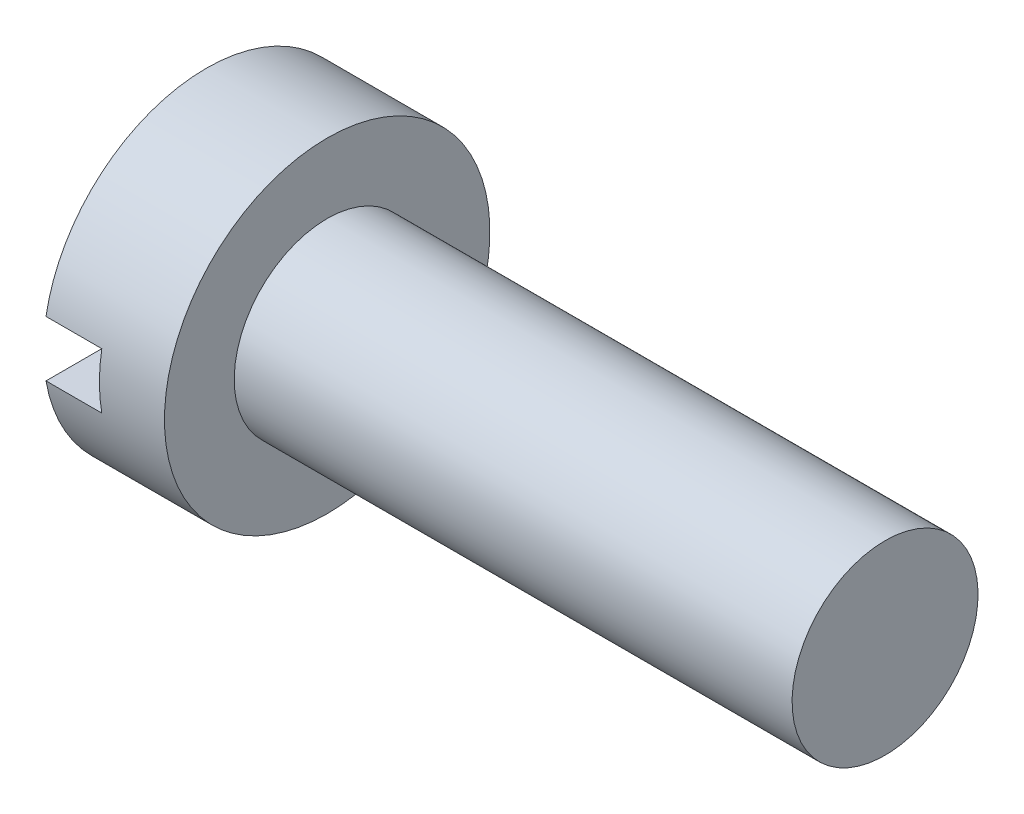
ISO-10303-21;
HEADER;
FILE_DESCRIPTION(('STEP AP214'),'2;1');
FILE_NAME('part.step','',(''),(''),'','','');
FILE_SCHEMA(('AUTOMOTIVE_DESIGN { 1 0 10303 214 1 1 1 1 }'));
ENDSEC;
DATA;
#1=APPLICATION_CONTEXT('core data for automotive mechanical design processes');
#2=APPLICATION_PROTOCOL_DEFINITION('international standard','automotive_design',2000,#1);
#3=PRODUCT_CONTEXT('',#1,'mechanical');
#4=PRODUCT('Part','Part','',(#3));
#5=PRODUCT_RELATED_PRODUCT_CATEGORY('part','',(#4));
#6=PRODUCT_DEFINITION_FORMATION('','',#4);
#7=PRODUCT_DEFINITION_CONTEXT('part definition',#1,'design');
#8=PRODUCT_DEFINITION('design','',#6,#7);
#9=PRODUCT_DEFINITION_SHAPE('','',#8);
#10=(LENGTH_UNIT() NAMED_UNIT(*) SI_UNIT(.MILLI.,.METRE.));
#11=(NAMED_UNIT(*) PLANE_ANGLE_UNIT() SI_UNIT($,.RADIAN.));
#12=(NAMED_UNIT(*) SI_UNIT($,.STERADIAN.) SOLID_ANGLE_UNIT());
#13=UNCERTAINTY_MEASURE_WITH_UNIT(LENGTH_MEASURE(1.E-05),#10,'distance_accuracy_value','');
#14=(GEOMETRIC_REPRESENTATION_CONTEXT(3) GLOBAL_UNCERTAINTY_ASSIGNED_CONTEXT((#13)) GLOBAL_UNIT_ASSIGNED_CONTEXT((#10,
#11,#12)) REPRESENTATION_CONTEXT('',''));
#15=CARTESIAN_POINT('',(0.,0.,0.));
#16=DIRECTION('',(0.,0.,1.));
#17=DIRECTION('',(1.,0.,0.));
#18=AXIS2_PLACEMENT_3D('',#15,#16,#17);
#19=CARTESIAN_POINT('',(0.,0.,0.));
#20=DIRECTION('',(-1.,0.,0.));
#21=DIRECTION('',(0.,-1.,0.));
#22=AXIS2_PLACEMENT_3D('',#19,#20,#21);
#23=PLANE('',#22);
#24=DIRECTION('',(0.,0.,-1.));
#25=VECTOR('',#24,1.);
#26=CARTESIAN_POINT('',(0.,0.599999999999996,-3.5));
#27=LINE('',#26,#25);
#28=CARTESIAN_POINT('',(0.,0.599999999999999,3.44818792991333));
#29=VERTEX_POINT('',#28);
#30=CARTESIAN_POINT('',(0.,0.599999999999996,-3.44818792991333));
#31=VERTEX_POINT('',#30);
#32=EDGE_CURVE('E83',#29,#31,#27,.T.);
#33=ORIENTED_EDGE('',*,*,#32,.F.);
#34=CARTESIAN_POINT('',(0.,0.,0.));
#35=DIRECTION('',(1.,0.,0.));
#36=DIRECTION('',(0.,1.,0.));
#37=AXIS2_PLACEMENT_3D('',#34,#35,#36);
#38=CIRCLE('',#37,3.5);
#39=EDGE_CURVE('E89',#31,#29,#38,.T.);
#40=ORIENTED_EDGE('',*,*,#39,.F.);
#41=EDGE_LOOP('',(#33,#40));
#42=FACE_BOUND('',#41,.T.);
#43=ADVANCED_FACE('F33',(#42),#23,.T.);
#44=DIRECTION('',(0.,0.,1.));
#45=VECTOR('',#44,1.);
#46=CARTESIAN_POINT('',(0.,-0.600000000000001,-3.5));
#47=LINE('',#46,#45);
#48=CARTESIAN_POINT('',(0.,-0.600000000000001,-3.44818792991333));
#49=VERTEX_POINT('',#48);
#50=CARTESIAN_POINT('',(0.,-0.599999999999999,3.44818792991333));
#51=VERTEX_POINT('',#50);
#52=EDGE_CURVE('E77',#49,#51,#47,.T.);
#53=ORIENTED_EDGE('',*,*,#52,.F.);
#54=EDGE_CURVE('E82',#51,#49,#38,.T.);
#55=ORIENTED_EDGE('',*,*,#54,.F.);
#56=EDGE_LOOP('',(#53,#55));
#57=FACE_BOUND('',#56,.T.);
#58=ADVANCED_FACE('F35',(#57),#23,.T.);
#59=CARTESIAN_POINT('',(14.6,0.,0.));
#60=DIRECTION('',(1.,0.,0.));
#61=DIRECTION('',(0.,1.,0.));
#62=AXIS2_PLACEMENT_3D('',#59,#60,#61);
#63=CYLINDRICAL_SURFACE('',#62,3.5);
#64=DIRECTION('',(1.,0.,0.));
#65=VECTOR('',#64,1.);
#66=CARTESIAN_POINT('',(14.6,0.599999999999996,-3.44818792991333));
#67=LINE('',#66,#65);
#68=CARTESIAN_POINT('',(1.2,0.599999999999996,-3.44818792991333));
#69=VERTEX_POINT('',#68);
#70=EDGE_CURVE('E11',#31,#69,#67,.T.);
#71=ORIENTED_EDGE('',*,*,#70,.F.);
#72=ORIENTED_EDGE('',*,*,#39,.T.);
#73=DIRECTION('',(1.,0.,0.));
#74=VECTOR('',#73,1.);
#75=CARTESIAN_POINT('',(14.6,0.599999999999999,3.44818792991333));
#76=LINE('',#75,#74);
#77=CARTESIAN_POINT('',(1.2,0.599999999999999,3.44818792991333));
#78=VERTEX_POINT('',#77);
#79=EDGE_CURVE('E98',#78,#29,#76,.F.);
#80=ORIENTED_EDGE('',*,*,#79,.F.);
#81=CARTESIAN_POINT('',(1.2,0.,0.));
#82=DIRECTION('',(-1.,0.,0.));
#83=DIRECTION('',(0.,0.,1.));
#84=AXIS2_PLACEMENT_3D('',#81,#82,#83);
#85=CIRCLE('',#84,3.5);
#86=CARTESIAN_POINT('',(1.2,-0.599999999999999,3.44818792991333));
#87=VERTEX_POINT('',#86);
#88=EDGE_CURVE('E48',#78,#87,#85,.F.);
#89=ORIENTED_EDGE('',*,*,#88,.T.);
#90=DIRECTION('',(1.,0.,0.));
#91=VECTOR('',#90,1.);
#92=CARTESIAN_POINT('',(14.6,-0.599999999999999,3.44818792991333));
#93=LINE('',#92,#91);
#94=EDGE_CURVE('E88',#51,#87,#93,.T.);
#95=ORIENTED_EDGE('',*,*,#94,.F.);
#96=ORIENTED_EDGE('',*,*,#54,.T.);
#97=DIRECTION('',(1.,0.,0.));
#98=VECTOR('',#97,1.);
#99=CARTESIAN_POINT('',(14.6,-0.600000000000001,-3.44818792991333));
#100=LINE('',#99,#98);
#101=CARTESIAN_POINT('',(1.2,-0.600000000000001,-3.44818792991333));
#102=VERTEX_POINT('',#101);
#103=EDGE_CURVE('E41',#102,#49,#100,.F.);
#104=ORIENTED_EDGE('',*,*,#103,.F.);
#105=EDGE_CURVE('E56',#102,#69,#85,.F.);
#106=ORIENTED_EDGE('',*,*,#105,.T.);
#107=EDGE_LOOP('',(#71,#72,#80,#89,#95,#96,#104,#106));
#108=FACE_BOUND('',#107,.T.);
#109=CARTESIAN_POINT('',(2.6,0.,0.));
#110=DIRECTION('',(1.,0.,0.));
#111=DIRECTION('',(0.,1.,0.));
#112=AXIS2_PLACEMENT_3D('',#109,#110,#111);
#113=CIRCLE('',#112,3.5);
#114=CARTESIAN_POINT('',(2.6,3.5,0.));
#115=VERTEX_POINT('',#114);
#116=EDGE_CURVE('E93',#115,#115,#113,.T.);
#117=ORIENTED_EDGE('',*,*,#116,.F.);
#118=EDGE_LOOP('',(#117));
#119=FACE_BOUND('',#118,.T.);
#120=ADVANCED_FACE('F86',(#108,#119),#63,.T.);
#121=CARTESIAN_POINT('',(2.6,3.5,0.));
#122=DIRECTION('',(1.,0.,0.));
#123=DIRECTION('',(0.,1.,0.));
#124=AXIS2_PLACEMENT_3D('',#121,#122,#123);
#125=PLANE('',#124);
#126=ORIENTED_EDGE('',*,*,#116,.T.);
#127=EDGE_LOOP('',(#126));
#128=FACE_BOUND('',#127,.T.);
#129=CARTESIAN_POINT('',(2.6,0.,0.));
#130=DIRECTION('',(1.,0.,0.));
#131=DIRECTION('',(0.,1.,0.));
#132=AXIS2_PLACEMENT_3D('',#129,#130,#131);
#133=CIRCLE('',#132,2.);
#134=CARTESIAN_POINT('',(2.6,2.,0.));
#135=VERTEX_POINT('',#134);
#136=EDGE_CURVE('E111',#135,#135,#133,.T.);
#137=ORIENTED_EDGE('',*,*,#136,.F.);
#138=EDGE_LOOP('',(#137));
#139=FACE_BOUND('',#138,.T.);
#140=ADVANCED_FACE('F118',(#128,#139),#125,.T.);
#141=CARTESIAN_POINT('',(14.6,0.,0.));
#142=DIRECTION('',(1.,0.,0.));
#143=DIRECTION('',(0.,1.,0.));
#144=AXIS2_PLACEMENT_3D('',#141,#142,#143);
#145=CYLINDRICAL_SURFACE('',#144,2.);
#146=ORIENTED_EDGE('',*,*,#136,.T.);
#147=EDGE_LOOP('',(#146));
#148=FACE_BOUND('',#147,.T.);
#149=CARTESIAN_POINT('',(14.6,0.,0.));
#150=DIRECTION('',(1.,0.,0.));
#151=DIRECTION('',(0.,1.,0.));
#152=AXIS2_PLACEMENT_3D('',#149,#150,#151);
#153=CIRCLE('',#152,2.);
#154=CARTESIAN_POINT('',(14.6,2.,0.));
#155=VERTEX_POINT('',#154);
#156=EDGE_CURVE('E109',#155,#155,#153,.T.);
#157=ORIENTED_EDGE('',*,*,#156,.F.);
#158=EDGE_LOOP('',(#157));
#159=FACE_BOUND('',#158,.T.);
#160=ADVANCED_FACE('F125',(#148,#159),#145,.T.);
#161=CARTESIAN_POINT('',(14.6,2.,0.));
#162=DIRECTION('',(1.,0.,0.));
#163=DIRECTION('',(0.,1.,0.));
#164=AXIS2_PLACEMENT_3D('',#161,#162,#163);
#165=PLANE('',#164);
#166=ORIENTED_EDGE('',*,*,#156,.T.);
#167=EDGE_LOOP('',(#166));
#168=FACE_BOUND('',#167,.T.);
#169=ADVANCED_FACE('F150',(#168),#165,.T.);
#170=CARTESIAN_POINT('',(1.2,0.599999999999996,-3.5));
#171=DIRECTION('',(0.,1.,0.));
#172=DIRECTION('',(0.,0.,1.));
#173=AXIS2_PLACEMENT_3D('',#170,#171,#172);
#174=PLANE('',#173);
#175=ORIENTED_EDGE('',*,*,#79,.T.);
#176=ORIENTED_EDGE('',*,*,#32,.T.);
#177=ORIENTED_EDGE('',*,*,#70,.T.);
#178=DIRECTION('',(0.,0.,-1.));
#179=VECTOR('',#178,1.);
#180=CARTESIAN_POINT('',(1.2,0.599999999999996,-3.5));
#181=LINE('',#180,#179);
#182=EDGE_CURVE('E105',#78,#69,#181,.T.);
#183=ORIENTED_EDGE('',*,*,#182,.F.);
#184=EDGE_LOOP('',(#175,#176,#177,#183));
#185=FACE_BOUND('',#184,.T.);
#186=ADVANCED_FACE('F145',(#185),#174,.F.);
#187=CARTESIAN_POINT('',(1.2,-0.600000000000001,-3.5));
#188=DIRECTION('',(0.,-1.,0.));
#189=DIRECTION('',(0.,0.,-1.));
#190=AXIS2_PLACEMENT_3D('',#187,#188,#189);
#191=PLANE('',#190);
#192=ORIENTED_EDGE('',*,*,#103,.T.);
#193=ORIENTED_EDGE('',*,*,#52,.T.);
#194=ORIENTED_EDGE('',*,*,#94,.T.);
#195=DIRECTION('',(0.,0.,1.));
#196=VECTOR('',#195,1.);
#197=CARTESIAN_POINT('',(1.2,-0.600000000000001,-3.5));
#198=LINE('',#197,#196);
#199=EDGE_CURVE('E78',#102,#87,#198,.T.);
#200=ORIENTED_EDGE('',*,*,#199,.F.);
#201=EDGE_LOOP('',(#192,#193,#194,#200));
#202=FACE_BOUND('',#201,.T.);
#203=ADVANCED_FACE('F76',(#202),#191,.F.);
#204=CARTESIAN_POINT('',(1.2,0.,0.));
#205=DIRECTION('',(-1.,0.,0.));
#206=DIRECTION('',(0.,0.,1.));
#207=AXIS2_PLACEMENT_3D('',#204,#205,#206);
#208=PLANE('',#207);
#209=ORIENTED_EDGE('',*,*,#199,.T.);
#210=ORIENTED_EDGE('',*,*,#88,.F.);
#211=ORIENTED_EDGE('',*,*,#182,.T.);
#212=ORIENTED_EDGE('',*,*,#105,.F.);
#213=EDGE_LOOP('',(#209,#210,#211,#212));
#214=FACE_BOUND('',#213,.T.);
#215=ADVANCED_FACE('F160',(#214),#208,.T.);
#216=CLOSED_SHELL('',(#43,#58,#120,#140,#160,#169,#186,#203,#215));
#217=MANIFOLD_SOLID_BREP('B2',#216);
#218=ADVANCED_BREP_SHAPE_REPRESENTATION('',(#18,#217),#14);
#219=SHAPE_DEFINITION_REPRESENTATION(#9,#218);
ENDSEC;
END-ISO-10303-21;
